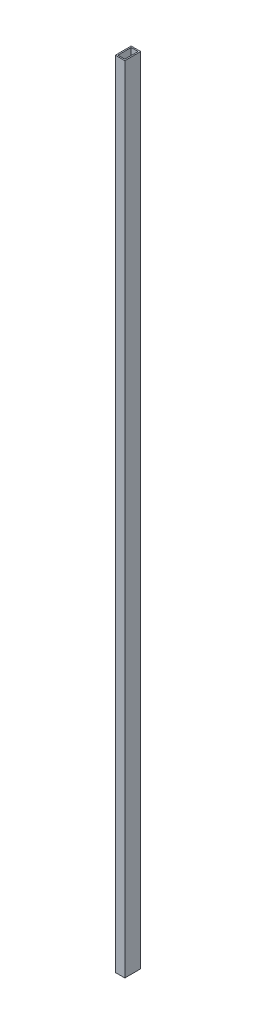
ISO-10303-21;
HEADER;
FILE_DESCRIPTION(('STEP AP214'),'2;1');
FILE_NAME('part.step','',(''),(''),'','','');
FILE_SCHEMA(('AUTOMOTIVE_DESIGN { 1 0 10303 214 1 1 1 1 }'));
ENDSEC;
DATA;
#1=APPLICATION_CONTEXT('core data for automotive mechanical design processes');
#2=APPLICATION_PROTOCOL_DEFINITION('international standard','automotive_design',2000,#1);
#3=PRODUCT_CONTEXT('',#1,'mechanical');
#4=PRODUCT('Part','Part','',(#3));
#5=PRODUCT_RELATED_PRODUCT_CATEGORY('part','',(#4));
#6=PRODUCT_DEFINITION_FORMATION('','',#4);
#7=PRODUCT_DEFINITION_CONTEXT('part definition',#1,'design');
#8=PRODUCT_DEFINITION('design','',#6,#7);
#9=PRODUCT_DEFINITION_SHAPE('','',#8);
#10=(LENGTH_UNIT() NAMED_UNIT(*) SI_UNIT(.MILLI.,.METRE.));
#11=(NAMED_UNIT(*) PLANE_ANGLE_UNIT() SI_UNIT($,.RADIAN.));
#12=(NAMED_UNIT(*) SI_UNIT($,.STERADIAN.) SOLID_ANGLE_UNIT());
#13=UNCERTAINTY_MEASURE_WITH_UNIT(LENGTH_MEASURE(1.E-05),#10,'distance_accuracy_value','');
#14=(GEOMETRIC_REPRESENTATION_CONTEXT(3) GLOBAL_UNCERTAINTY_ASSIGNED_CONTEXT((#13)) GLOBAL_UNIT_ASSIGNED_CONTEXT((#10,
#11,#12)) REPRESENTATION_CONTEXT('',''));
#15=CARTESIAN_POINT('',(0.,0.,0.));
#16=DIRECTION('',(0.,0.,1.));
#17=DIRECTION('',(1.,0.,0.));
#18=AXIS2_PLACEMENT_3D('',#15,#16,#17);
#19=CARTESIAN_POINT('',(0.,2500.,0.));
#20=DIRECTION('',(0.,-1.,0.));
#21=DIRECTION('',(0.,0.,-1.));
#22=AXIS2_PLACEMENT_3D('',#19,#20,#21);
#23=PLANE('',#22);
#24=DIRECTION('',(0.,0.,-1.));
#25=VECTOR('',#24,1.);
#26=CARTESIAN_POINT('',(15.,2500.,25.));
#27=LINE('',#26,#25);
#28=CARTESIAN_POINT('',(15.,2500.,25.));
#29=VERTEX_POINT('',#28);
#30=CARTESIAN_POINT('',(15.,2500.,-25.));
#31=VERTEX_POINT('',#30);
#32=EDGE_CURVE('E134',#29,#31,#27,.T.);
#33=ORIENTED_EDGE('',*,*,#32,.T.);
#34=DIRECTION('',(-1.,0.,0.));
#35=VECTOR('',#34,1.);
#36=CARTESIAN_POINT('',(-15.,2500.,-25.));
#37=LINE('',#36,#35);
#38=CARTESIAN_POINT('',(-15.,2500.,-25.));
#39=VERTEX_POINT('',#38);
#40=EDGE_CURVE('E137',#31,#39,#37,.T.);
#41=ORIENTED_EDGE('',*,*,#40,.T.);
#42=DIRECTION('',(0.,0.,1.));
#43=VECTOR('',#42,1.);
#44=CARTESIAN_POINT('',(-15.,2500.,25.));
#45=LINE('',#44,#43);
#46=CARTESIAN_POINT('',(-15.,2500.,25.));
#47=VERTEX_POINT('',#46);
#48=EDGE_CURVE('E140',#39,#47,#45,.T.);
#49=ORIENTED_EDGE('',*,*,#48,.T.);
#50=DIRECTION('',(1.,0.,0.));
#51=VECTOR('',#50,1.);
#52=CARTESIAN_POINT('',(-15.,2500.,25.));
#53=LINE('',#52,#51);
#54=EDGE_CURVE('E142',#47,#29,#53,.T.);
#55=ORIENTED_EDGE('',*,*,#54,.T.);
#56=EDGE_LOOP('',(#33,#41,#49,#55));
#57=FACE_BOUND('',#56,.T.);
#58=DIRECTION('',(0.,0.,-1.));
#59=VECTOR('',#58,1.);
#60=CARTESIAN_POINT('',(11.,2500.,21.));
#61=LINE('',#60,#59);
#62=CARTESIAN_POINT('',(11.,2500.,21.));
#63=VERTEX_POINT('',#62);
#64=CARTESIAN_POINT('',(11.,2500.,-21.));
#65=VERTEX_POINT('',#64);
#66=EDGE_CURVE('E98',#63,#65,#61,.T.);
#67=ORIENTED_EDGE('',*,*,#66,.F.);
#68=DIRECTION('',(1.,0.,0.));
#69=VECTOR('',#68,1.);
#70=CARTESIAN_POINT('',(-11.,2500.,21.));
#71=LINE('',#70,#69);
#72=CARTESIAN_POINT('',(-11.,2500.,21.));
#73=VERTEX_POINT('',#72);
#74=EDGE_CURVE('E120',#73,#63,#71,.T.);
#75=ORIENTED_EDGE('',*,*,#74,.F.);
#76=DIRECTION('',(0.,0.,1.));
#77=VECTOR('',#76,1.);
#78=CARTESIAN_POINT('',(-11.,2500.,21.));
#79=LINE('',#78,#77);
#80=CARTESIAN_POINT('',(-11.,2500.,-21.));
#81=VERTEX_POINT('',#80);
#82=EDGE_CURVE('E118',#81,#73,#79,.T.);
#83=ORIENTED_EDGE('',*,*,#82,.F.);
#84=DIRECTION('',(-1.,0.,0.));
#85=VECTOR('',#84,1.);
#86=CARTESIAN_POINT('',(-11.,2500.,-21.));
#87=LINE('',#86,#85);
#88=EDGE_CURVE('E106',#65,#81,#87,.T.);
#89=ORIENTED_EDGE('',*,*,#88,.F.);
#90=EDGE_LOOP('',(#67,#75,#83,#89));
#91=FACE_BOUND('',#90,.T.);
#92=ADVANCED_FACE('F33',(#57,#91),#23,.F.);
#93=CARTESIAN_POINT('',(0.,0.,0.));
#94=DIRECTION('',(0.,-1.,0.));
#95=DIRECTION('',(0.,0.,-1.));
#96=AXIS2_PLACEMENT_3D('',#93,#94,#95);
#97=PLANE('',#96);
#98=DIRECTION('',(0.,0.,-1.));
#99=VECTOR('',#98,1.);
#100=CARTESIAN_POINT('',(15.,0.,25.));
#101=LINE('',#100,#99);
#102=CARTESIAN_POINT('',(15.,0.,25.));
#103=VERTEX_POINT('',#102);
#104=CARTESIAN_POINT('',(15.,0.,-25.));
#105=VERTEX_POINT('',#104);
#106=EDGE_CURVE('E114',#103,#105,#101,.T.);
#107=ORIENTED_EDGE('',*,*,#106,.F.);
#108=DIRECTION('',(1.,0.,0.));
#109=VECTOR('',#108,1.);
#110=CARTESIAN_POINT('',(-15.,0.,25.));
#111=LINE('',#110,#109);
#112=CARTESIAN_POINT('',(-15.,0.,25.));
#113=VERTEX_POINT('',#112);
#114=EDGE_CURVE('E138',#113,#103,#111,.T.);
#115=ORIENTED_EDGE('',*,*,#114,.F.);
#116=DIRECTION('',(0.,0.,1.));
#117=VECTOR('',#116,1.);
#118=CARTESIAN_POINT('',(-15.,0.,25.));
#119=LINE('',#118,#117);
#120=CARTESIAN_POINT('',(-15.,0.,-25.));
#121=VERTEX_POINT('',#120);
#122=EDGE_CURVE('E149',#121,#113,#119,.T.);
#123=ORIENTED_EDGE('',*,*,#122,.F.);
#124=DIRECTION('',(-1.,0.,0.));
#125=VECTOR('',#124,1.);
#126=CARTESIAN_POINT('',(-15.,0.,-25.));
#127=LINE('',#126,#125);
#128=EDGE_CURVE('E147',#105,#121,#127,.T.);
#129=ORIENTED_EDGE('',*,*,#128,.F.);
#130=EDGE_LOOP('',(#107,#115,#123,#129));
#131=FACE_BOUND('',#130,.T.);
#132=DIRECTION('',(1.,0.,0.));
#133=VECTOR('',#132,1.);
#134=CARTESIAN_POINT('',(-11.,0.,21.));
#135=LINE('',#134,#133);
#136=CARTESIAN_POINT('',(-11.,0.,21.));
#137=VERTEX_POINT('',#136);
#138=CARTESIAN_POINT('',(11.,0.,21.));
#139=VERTEX_POINT('',#138);
#140=EDGE_CURVE('E107',#137,#139,#135,.T.);
#141=ORIENTED_EDGE('',*,*,#140,.T.);
#142=DIRECTION('',(0.,0.,-1.));
#143=VECTOR('',#142,1.);
#144=CARTESIAN_POINT('',(11.,0.,21.));
#145=LINE('',#144,#143);
#146=CARTESIAN_POINT('',(11.,0.,-21.));
#147=VERTEX_POINT('',#146);
#148=EDGE_CURVE('E56',#139,#147,#145,.T.);
#149=ORIENTED_EDGE('',*,*,#148,.T.);
#150=DIRECTION('',(-1.,0.,0.));
#151=VECTOR('',#150,1.);
#152=CARTESIAN_POINT('',(-11.,0.,-21.));
#153=LINE('',#152,#151);
#154=CARTESIAN_POINT('',(-11.,0.,-21.));
#155=VERTEX_POINT('',#154);
#156=EDGE_CURVE('E113',#147,#155,#153,.T.);
#157=ORIENTED_EDGE('',*,*,#156,.T.);
#158=DIRECTION('',(0.,0.,1.));
#159=VECTOR('',#158,1.);
#160=CARTESIAN_POINT('',(-11.,0.,21.));
#161=LINE('',#160,#159);
#162=EDGE_CURVE('E126',#155,#137,#161,.T.);
#163=ORIENTED_EDGE('',*,*,#162,.T.);
#164=EDGE_LOOP('',(#141,#149,#157,#163));
#165=FACE_BOUND('',#164,.T.);
#166=ADVANCED_FACE('F167',(#131,#165),#97,.T.);
#167=CARTESIAN_POINT('',(15.,2500.,25.));
#168=DIRECTION('',(-1.,0.,0.));
#169=DIRECTION('',(0.,0.,1.));
#170=AXIS2_PLACEMENT_3D('',#167,#168,#169);
#171=PLANE('',#170);
#172=ORIENTED_EDGE('',*,*,#106,.T.);
#173=DIRECTION('',(0.,-1.,0.));
#174=VECTOR('',#173,1.);
#175=CARTESIAN_POINT('',(15.,2500.,-25.));
#176=LINE('',#175,#174);
#177=EDGE_CURVE('E11',#31,#105,#176,.T.);
#178=ORIENTED_EDGE('',*,*,#177,.F.);
#179=ORIENTED_EDGE('',*,*,#32,.F.);
#180=DIRECTION('',(0.,-1.,0.));
#181=VECTOR('',#180,1.);
#182=CARTESIAN_POINT('',(15.,2500.,25.));
#183=LINE('',#182,#181);
#184=EDGE_CURVE('E144',#29,#103,#183,.T.);
#185=ORIENTED_EDGE('',*,*,#184,.T.);
#186=EDGE_LOOP('',(#172,#178,#179,#185));
#187=FACE_BOUND('',#186,.T.);
#188=ADVANCED_FACE('F35',(#187),#171,.F.);
#189=CARTESIAN_POINT('',(-15.,2500.,-25.));
#190=DIRECTION('',(0.,0.,1.));
#191=DIRECTION('',(1.,0.,0.));
#192=AXIS2_PLACEMENT_3D('',#189,#190,#191);
#193=PLANE('',#192);
#194=ORIENTED_EDGE('',*,*,#128,.T.);
#195=DIRECTION('',(0.,-1.,0.));
#196=VECTOR('',#195,1.);
#197=CARTESIAN_POINT('',(-15.,2500.,-25.));
#198=LINE('',#197,#196);
#199=EDGE_CURVE('E41',#39,#121,#198,.T.);
#200=ORIENTED_EDGE('',*,*,#199,.F.);
#201=ORIENTED_EDGE('',*,*,#40,.F.);
#202=ORIENTED_EDGE('',*,*,#177,.T.);
#203=EDGE_LOOP('',(#194,#200,#201,#202));
#204=FACE_BOUND('',#203,.T.);
#205=ADVANCED_FACE('F177',(#204),#193,.F.);
#206=CARTESIAN_POINT('',(-15.,2500.,25.));
#207=DIRECTION('',(1.,0.,0.));
#208=DIRECTION('',(0.,0.,-1.));
#209=AXIS2_PLACEMENT_3D('',#206,#207,#208);
#210=PLANE('',#209);
#211=ORIENTED_EDGE('',*,*,#122,.T.);
#212=DIRECTION('',(0.,-1.,0.));
#213=VECTOR('',#212,1.);
#214=CARTESIAN_POINT('',(-15.,2500.,25.));
#215=LINE('',#214,#213);
#216=EDGE_CURVE('E154',#47,#113,#215,.T.);
#217=ORIENTED_EDGE('',*,*,#216,.F.);
#218=ORIENTED_EDGE('',*,*,#48,.F.);
#219=ORIENTED_EDGE('',*,*,#199,.T.);
#220=EDGE_LOOP('',(#211,#217,#218,#219));
#221=FACE_BOUND('',#220,.T.);
#222=ADVANCED_FACE('F161',(#221),#210,.F.);
#223=CARTESIAN_POINT('',(-15.,2500.,25.));
#224=DIRECTION('',(0.,0.,-1.));
#225=DIRECTION('',(-1.,0.,0.));
#226=AXIS2_PLACEMENT_3D('',#223,#224,#225);
#227=PLANE('',#226);
#228=ORIENTED_EDGE('',*,*,#114,.T.);
#229=ORIENTED_EDGE('',*,*,#184,.F.);
#230=ORIENTED_EDGE('',*,*,#54,.F.);
#231=ORIENTED_EDGE('',*,*,#216,.T.);
#232=EDGE_LOOP('',(#228,#229,#230,#231));
#233=FACE_BOUND('',#232,.T.);
#234=ADVANCED_FACE('F171',(#233),#227,.F.);
#235=CARTESIAN_POINT('',(11.,2500.,21.));
#236=DIRECTION('',(-1.,0.,0.));
#237=DIRECTION('',(0.,0.,1.));
#238=AXIS2_PLACEMENT_3D('',#235,#236,#237);
#239=PLANE('',#238);
#240=ORIENTED_EDGE('',*,*,#148,.F.);
#241=DIRECTION('',(0.,-1.,0.));
#242=VECTOR('',#241,1.);
#243=CARTESIAN_POINT('',(11.,2500.,21.));
#244=LINE('',#243,#242);
#245=EDGE_CURVE('E102',#63,#139,#244,.T.);
#246=ORIENTED_EDGE('',*,*,#245,.F.);
#247=ORIENTED_EDGE('',*,*,#66,.T.);
#248=DIRECTION('',(0.,-1.,0.));
#249=VECTOR('',#248,1.);
#250=CARTESIAN_POINT('',(11.,2500.,-21.));
#251=LINE('',#250,#249);
#252=EDGE_CURVE('E101',#65,#147,#251,.T.);
#253=ORIENTED_EDGE('',*,*,#252,.T.);
#254=EDGE_LOOP('',(#240,#246,#247,#253));
#255=FACE_BOUND('',#254,.T.);
#256=ADVANCED_FACE('F100',(#255),#239,.T.);
#257=CARTESIAN_POINT('',(-11.,2500.,-21.));
#258=DIRECTION('',(0.,0.,1.));
#259=DIRECTION('',(1.,0.,0.));
#260=AXIS2_PLACEMENT_3D('',#257,#258,#259);
#261=PLANE('',#260);
#262=ORIENTED_EDGE('',*,*,#156,.F.);
#263=ORIENTED_EDGE('',*,*,#252,.F.);
#264=ORIENTED_EDGE('',*,*,#88,.T.);
#265=DIRECTION('',(0.,-1.,0.));
#266=VECTOR('',#265,1.);
#267=CARTESIAN_POINT('',(-11.,2500.,-21.));
#268=LINE('',#267,#266);
#269=EDGE_CURVE('E115',#81,#155,#268,.T.);
#270=ORIENTED_EDGE('',*,*,#269,.T.);
#271=EDGE_LOOP('',(#262,#263,#264,#270));
#272=FACE_BOUND('',#271,.T.);
#273=ADVANCED_FACE('F110',(#272),#261,.T.);
#274=CARTESIAN_POINT('',(-11.,2500.,21.));
#275=DIRECTION('',(1.,0.,0.));
#276=DIRECTION('',(0.,0.,-1.));
#277=AXIS2_PLACEMENT_3D('',#274,#275,#276);
#278=PLANE('',#277);
#279=ORIENTED_EDGE('',*,*,#162,.F.);
#280=ORIENTED_EDGE('',*,*,#269,.F.);
#281=ORIENTED_EDGE('',*,*,#82,.T.);
#282=DIRECTION('',(0.,-1.,0.));
#283=VECTOR('',#282,1.);
#284=CARTESIAN_POINT('',(-11.,2500.,21.));
#285=LINE('',#284,#283);
#286=EDGE_CURVE('E48',#73,#137,#285,.T.);
#287=ORIENTED_EDGE('',*,*,#286,.T.);
#288=EDGE_LOOP('',(#279,#280,#281,#287));
#289=FACE_BOUND('',#288,.T.);
#290=ADVANCED_FACE('F200',(#289),#278,.T.);
#291=CARTESIAN_POINT('',(-11.,2500.,21.));
#292=DIRECTION('',(0.,0.,-1.));
#293=DIRECTION('',(-1.,0.,0.));
#294=AXIS2_PLACEMENT_3D('',#291,#292,#293);
#295=PLANE('',#294);
#296=ORIENTED_EDGE('',*,*,#140,.F.);
#297=ORIENTED_EDGE('',*,*,#286,.F.);
#298=ORIENTED_EDGE('',*,*,#74,.T.);
#299=ORIENTED_EDGE('',*,*,#245,.T.);
#300=EDGE_LOOP('',(#296,#297,#298,#299));
#301=FACE_BOUND('',#300,.T.);
#302=ADVANCED_FACE('F204',(#301),#295,.T.);
#303=CLOSED_SHELL('',(#92,#166,#188,#205,#222,#234,#256,#273,#290,#302));
#304=MANIFOLD_SOLID_BREP('B2',#303);
#305=ADVANCED_BREP_SHAPE_REPRESENTATION('',(#18,#304),#14);
#306=SHAPE_DEFINITION_REPRESENTATION(#9,#305);
ENDSEC;
END-ISO-10303-21;
